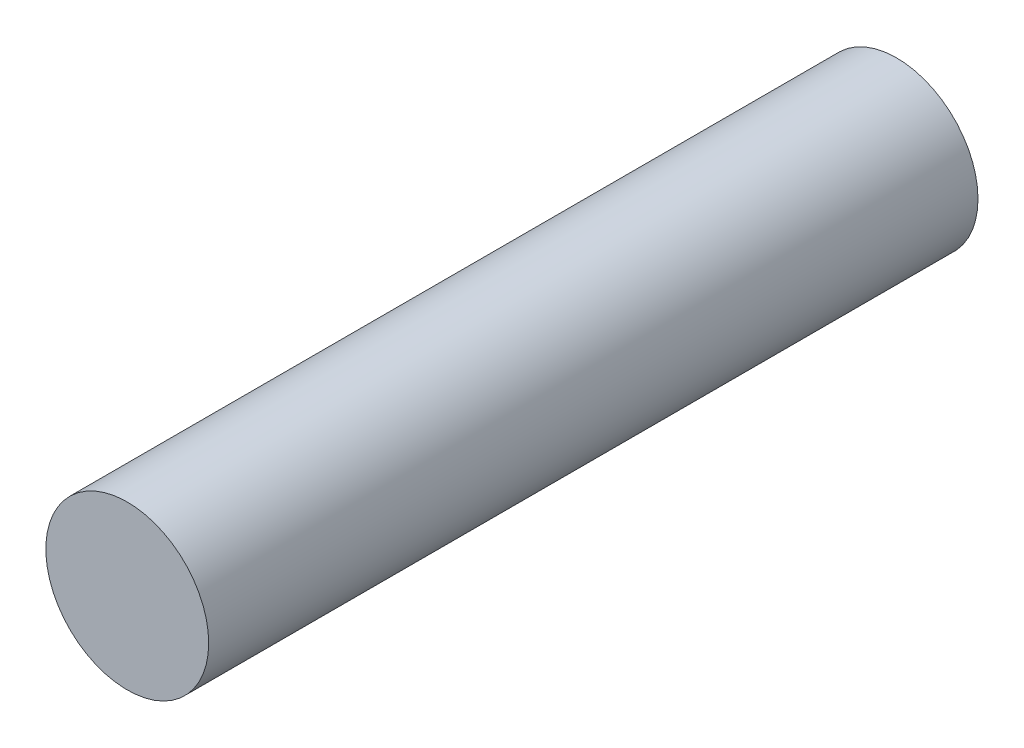
ISO-10303-21;
HEADER;
FILE_DESCRIPTION(('STEP AP214'),'2;1');
FILE_NAME('part.step','',(''),(''),'','','');
FILE_SCHEMA(('AUTOMOTIVE_DESIGN { 1 0 10303 214 1 1 1 1 }'));
ENDSEC;
DATA;
#1=APPLICATION_CONTEXT('core data for automotive mechanical design processes');
#2=APPLICATION_PROTOCOL_DEFINITION('international standard','automotive_design',2000,#1);
#3=PRODUCT_CONTEXT('',#1,'mechanical');
#4=PRODUCT('Part','Part','',(#3));
#5=PRODUCT_RELATED_PRODUCT_CATEGORY('part','',(#4));
#6=PRODUCT_DEFINITION_FORMATION('','',#4);
#7=PRODUCT_DEFINITION_CONTEXT('part definition',#1,'design');
#8=PRODUCT_DEFINITION('design','',#6,#7);
#9=PRODUCT_DEFINITION_SHAPE('','',#8);
#10=(LENGTH_UNIT() NAMED_UNIT(*) SI_UNIT(.MILLI.,.METRE.));
#11=(NAMED_UNIT(*) PLANE_ANGLE_UNIT() SI_UNIT($,.RADIAN.));
#12=(NAMED_UNIT(*) SI_UNIT($,.STERADIAN.) SOLID_ANGLE_UNIT());
#13=UNCERTAINTY_MEASURE_WITH_UNIT(LENGTH_MEASURE(1.E-05),#10,'distance_accuracy_value','');
#14=(GEOMETRIC_REPRESENTATION_CONTEXT(3) GLOBAL_UNCERTAINTY_ASSIGNED_CONTEXT((#13)) GLOBAL_UNIT_ASSIGNED_CONTEXT((#10,
#11,#12)) REPRESENTATION_CONTEXT('',''));
#15=CARTESIAN_POINT('',(0.,0.,0.));
#16=DIRECTION('',(0.,0.,1.));
#17=DIRECTION('',(1.,0.,0.));
#18=AXIS2_PLACEMENT_3D('',#15,#16,#17);
#19=CARTESIAN_POINT('',(0.,0.,-293.));
#20=DIRECTION('',(0.,0.,1.));
#21=DIRECTION('',(1.,0.,0.));
#22=AXIS2_PLACEMENT_3D('',#19,#20,#21);
#23=CYLINDRICAL_SURFACE('',#22,50.8);
#24=CARTESIAN_POINT('',(0.,0.,-293.));
#25=DIRECTION('',(0.,0.,1.));
#26=DIRECTION('',(1.,0.,0.));
#27=AXIS2_PLACEMENT_3D('',#24,#25,#26);
#28=CIRCLE('',#27,50.8);
#29=CARTESIAN_POINT('',(50.8,0.,-293.));
#30=VERTEX_POINT('',#29);
#31=EDGE_CURVE('E10',#30,#30,#28,.T.);
#32=ORIENTED_EDGE('',*,*,#31,.T.);
#33=EDGE_LOOP('',(#32));
#34=FACE_BOUND('',#33,.T.);
#35=CARTESIAN_POINT('',(0.,0.,187.));
#36=DIRECTION('',(0.,0.,1.));
#37=DIRECTION('',(1.,0.,0.));
#38=AXIS2_PLACEMENT_3D('',#35,#36,#37);
#39=CIRCLE('',#38,50.8);
#40=CARTESIAN_POINT('',(50.8,0.,187.));
#41=VERTEX_POINT('',#40);
#42=EDGE_CURVE('E44',#41,#41,#39,.T.);
#43=ORIENTED_EDGE('',*,*,#42,.F.);
#44=EDGE_LOOP('',(#43));
#45=FACE_BOUND('',#44,.T.);
#46=ADVANCED_FACE('F37',(#34,#45),#23,.T.);
#47=CARTESIAN_POINT('',(0.,0.,-293.));
#48=DIRECTION('',(0.,0.,1.));
#49=DIRECTION('',(1.,0.,0.));
#50=AXIS2_PLACEMENT_3D('',#47,#48,#49);
#51=PLANE('',#50);
#52=ORIENTED_EDGE('',*,*,#31,.F.);
#53=EDGE_LOOP('',(#52));
#54=FACE_BOUND('',#53,.T.);
#55=ADVANCED_FACE('F54',(#54),#51,.F.);
#56=CARTESIAN_POINT('',(0.,0.,187.));
#57=DIRECTION('',(0.,0.,1.));
#58=DIRECTION('',(1.,0.,0.));
#59=AXIS2_PLACEMENT_3D('',#56,#57,#58);
#60=PLANE('',#59);
#61=ORIENTED_EDGE('',*,*,#42,.T.);
#62=EDGE_LOOP('',(#61));
#63=FACE_BOUND('',#62,.T.);
#64=ADVANCED_FACE('F51',(#63),#60,.T.);
#65=CLOSED_SHELL('',(#46,#55,#64));
#66=MANIFOLD_SOLID_BREP('B2',#65);
#67=ADVANCED_BREP_SHAPE_REPRESENTATION('',(#18,#66),#14);
#68=SHAPE_DEFINITION_REPRESENTATION(#9,#67);
ENDSEC;
END-ISO-10303-21;
